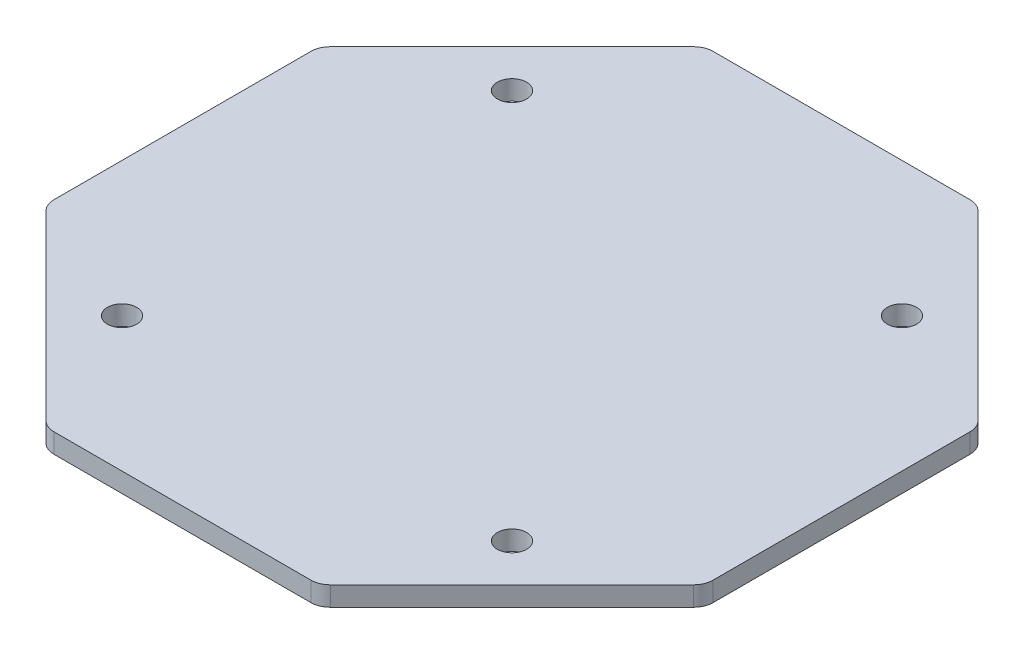
ISO-10303-21;
HEADER;
FILE_DESCRIPTION(('STEP AP214'),'2;1');
FILE_NAME('part.step','',(''),(''),'','','');
FILE_SCHEMA(('AUTOMOTIVE_DESIGN { 1 0 10303 214 1 1 1 1 }'));
ENDSEC;
DATA;
#1=APPLICATION_CONTEXT('core data for automotive mechanical design processes');
#2=APPLICATION_PROTOCOL_DEFINITION('international standard','automotive_design',2000,#1);
#3=PRODUCT_CONTEXT('',#1,'mechanical');
#4=PRODUCT('Part','Part','',(#3));
#5=PRODUCT_RELATED_PRODUCT_CATEGORY('part','',(#4));
#6=PRODUCT_DEFINITION_FORMATION('','',#4);
#7=PRODUCT_DEFINITION_CONTEXT('part definition',#1,'design');
#8=PRODUCT_DEFINITION('design','',#6,#7);
#9=PRODUCT_DEFINITION_SHAPE('','',#8);
#10=(LENGTH_UNIT() NAMED_UNIT(*) SI_UNIT(.MILLI.,.METRE.));
#11=(NAMED_UNIT(*) PLANE_ANGLE_UNIT() SI_UNIT($,.RADIAN.));
#12=(NAMED_UNIT(*) SI_UNIT($,.STERADIAN.) SOLID_ANGLE_UNIT());
#13=UNCERTAINTY_MEASURE_WITH_UNIT(LENGTH_MEASURE(1.E-05),#10,'distance_accuracy_value','');
#14=(GEOMETRIC_REPRESENTATION_CONTEXT(3) GLOBAL_UNCERTAINTY_ASSIGNED_CONTEXT((#13)) GLOBAL_UNIT_ASSIGNED_CONTEXT((#10,
#11,#12)) REPRESENTATION_CONTEXT('',''));
#15=CARTESIAN_POINT('',(0.,0.,0.));
#16=DIRECTION('',(0.,0.,1.));
#17=DIRECTION('',(1.,0.,0.));
#18=AXIS2_PLACEMENT_3D('',#15,#16,#17);
#19=CARTESIAN_POINT('',(-33.7989898732233,2.,-14.));
#20=DIRECTION('',(0.707106781186549,0.,0.707106781186546));
#21=DIRECTION('',(0.707106781186546,0.,-0.707106781186549));
#22=AXIS2_PLACEMENT_3D('',#19,#20,#21);
#23=PLANE('',#22);
#24=DIRECTION('',(-0.707106781186546,0.,0.707106781186549));
#25=VECTOR('',#24,1.);
#26=CARTESIAN_POINT('',(-33.7989898732233,0.,-14.));
#27=LINE('',#26,#25);
#28=CARTESIAN_POINT('',(-14.5857864376269,0.,-33.2132034355965));
#29=VERTEX_POINT('',#28);
#30=CARTESIAN_POINT('',(-33.2132034355964,0.,-14.5857864376269));
#31=VERTEX_POINT('',#30);
#32=EDGE_CURVE('E198',#29,#31,#27,.T.);
#33=ORIENTED_EDGE('',*,*,#32,.T.);
#34=DIRECTION('',(0.,-1.,0.));
#35=VECTOR('',#34,1.);
#36=CARTESIAN_POINT('',(-33.2132034355964,2.,-14.5857864376269));
#37=LINE('',#36,#35);
#38=CARTESIAN_POINT('',(-33.2132034355964,2.,-14.5857864376269));
#39=VERTEX_POINT('',#38);
#40=EDGE_CURVE('E271',#31,#39,#37,.F.);
#41=ORIENTED_EDGE('',*,*,#40,.T.);
#42=DIRECTION('',(-0.707106781186546,0.,0.707106781186549));
#43=VECTOR('',#42,1.);
#44=CARTESIAN_POINT('',(-33.7989898732233,2.,-14.));
#45=LINE('',#44,#43);
#46=CARTESIAN_POINT('',(-14.5857864376269,2.,-33.2132034355965));
#47=VERTEX_POINT('',#46);
#48=EDGE_CURVE('E216',#47,#39,#45,.T.);
#49=ORIENTED_EDGE('',*,*,#48,.F.);
#50=DIRECTION('',(0.,-1.,0.));
#51=VECTOR('',#50,1.);
#52=CARTESIAN_POINT('',(-14.5857864376269,2.,-33.2132034355965));
#53=LINE('',#52,#51);
#54=EDGE_CURVE('E267',#47,#29,#53,.T.);
#55=ORIENTED_EDGE('',*,*,#54,.T.);
#56=EDGE_LOOP('',(#33,#41,#49,#55));
#57=FACE_BOUND('',#56,.T.);
#58=ADVANCED_FACE('F44',(#57),#23,.F.);
#59=CARTESIAN_POINT('',(-33.7989898732233,2.,14.));
#60=DIRECTION('',(1.,0.,0.));
#61=DIRECTION('',(0.,0.,-1.));
#62=AXIS2_PLACEMENT_3D('',#59,#60,#61);
#63=PLANE('',#62);
#64=DIRECTION('',(0.,0.,1.));
#65=VECTOR('',#64,1.);
#66=CARTESIAN_POINT('',(-33.7989898732233,0.,14.));
#67=LINE('',#66,#65);
#68=CARTESIAN_POINT('',(-33.7989898732233,0.,-13.1715728752538));
#69=VERTEX_POINT('',#68);
#70=CARTESIAN_POINT('',(-33.7989898732233,0.,13.1715728752538));
#71=VERTEX_POINT('',#70);
#72=EDGE_CURVE('E191',#69,#71,#67,.T.);
#73=ORIENTED_EDGE('',*,*,#72,.T.);
#74=DIRECTION('',(0.,-1.,0.));
#75=VECTOR('',#74,1.);
#76=CARTESIAN_POINT('',(-33.7989898732233,2.,13.1715728752538));
#77=LINE('',#76,#75);
#78=CARTESIAN_POINT('',(-33.7989898732233,2.,13.1715728752538));
#79=VERTEX_POINT('',#78);
#80=EDGE_CURVE('E166',#71,#79,#77,.F.);
#81=ORIENTED_EDGE('',*,*,#80,.T.);
#82=DIRECTION('',(0.,0.,1.));
#83=VECTOR('',#82,1.);
#84=CARTESIAN_POINT('',(-33.7989898732233,2.,14.));
#85=LINE('',#84,#83);
#86=CARTESIAN_POINT('',(-33.7989898732233,2.,-13.1715728752538));
#87=VERTEX_POINT('',#86);
#88=EDGE_CURVE('E346',#87,#79,#85,.T.);
#89=ORIENTED_EDGE('',*,*,#88,.F.);
#90=DIRECTION('',(0.,-1.,0.));
#91=VECTOR('',#90,1.);
#92=CARTESIAN_POINT('',(-33.7989898732233,2.,-13.1715728752538));
#93=LINE('',#92,#91);
#94=EDGE_CURVE('E172',#87,#69,#93,.T.);
#95=ORIENTED_EDGE('',*,*,#94,.T.);
#96=EDGE_LOOP('',(#73,#81,#89,#95));
#97=FACE_BOUND('',#96,.T.);
#98=ADVANCED_FACE('F382',(#97),#63,.F.);
#99=CARTESIAN_POINT('',(-14.,2.,33.7989898732234));
#100=DIRECTION('',(0.707106781186549,0.,-0.707106781186546));
#101=DIRECTION('',(-0.707106781186546,0.,-0.707106781186549));
#102=AXIS2_PLACEMENT_3D('',#99,#100,#101);
#103=PLANE('',#102);
#104=DIRECTION('',(0.707106781186546,0.,0.707106781186549));
#105=VECTOR('',#104,1.);
#106=CARTESIAN_POINT('',(-14.,2.,33.7989898732234));
#107=LINE('',#106,#105);
#108=CARTESIAN_POINT('',(-33.2132034355964,2.,14.5857864376269));
#109=VERTEX_POINT('',#108);
#110=CARTESIAN_POINT('',(-14.5857864376269,2.,33.2132034355965));
#111=VERTEX_POINT('',#110);
#112=EDGE_CURVE('E182',#109,#111,#107,.T.);
#113=ORIENTED_EDGE('',*,*,#112,.F.);
#114=DIRECTION('',(0.,-1.,0.));
#115=VECTOR('',#114,1.);
#116=CARTESIAN_POINT('',(-33.2132034355964,2.,14.5857864376269));
#117=LINE('',#116,#115);
#118=CARTESIAN_POINT('',(-33.2132034355964,0.,14.5857864376269));
#119=VERTEX_POINT('',#118);
#120=EDGE_CURVE('E165',#109,#119,#117,.T.);
#121=ORIENTED_EDGE('',*,*,#120,.T.);
#122=DIRECTION('',(0.707106781186546,0.,0.707106781186549));
#123=VECTOR('',#122,1.);
#124=CARTESIAN_POINT('',(-14.,0.,33.7989898732234));
#125=LINE('',#124,#123);
#126=CARTESIAN_POINT('',(-14.5857864376269,0.,33.2132034355965));
#127=VERTEX_POINT('',#126);
#128=EDGE_CURVE('E179',#119,#127,#125,.T.);
#129=ORIENTED_EDGE('',*,*,#128,.T.);
#130=DIRECTION('',(0.,-1.,0.));
#131=VECTOR('',#130,1.);
#132=CARTESIAN_POINT('',(-14.5857864376269,2.,33.2132034355965));
#133=LINE('',#132,#131);
#134=EDGE_CURVE('E185',#127,#111,#133,.F.);
#135=ORIENTED_EDGE('',*,*,#134,.T.);
#136=EDGE_LOOP('',(#113,#121,#129,#135));
#137=FACE_BOUND('',#136,.T.);
#138=ADVANCED_FACE('F178',(#137),#103,.F.);
#139=CARTESIAN_POINT('',(14.,2.,33.7989898732234));
#140=DIRECTION('',(0.,0.,-1.));
#141=DIRECTION('',(-1.,0.,0.));
#142=AXIS2_PLACEMENT_3D('',#139,#140,#141);
#143=PLANE('',#142);
#144=DIRECTION('',(1.,0.,0.));
#145=VECTOR('',#144,1.);
#146=CARTESIAN_POINT('',(14.,0.,33.7989898732234));
#147=LINE('',#146,#145);
#148=CARTESIAN_POINT('',(-13.1715728752538,0.,33.7989898732234));
#149=VERTEX_POINT('',#148);
#150=CARTESIAN_POINT('',(13.1715728752538,0.,33.7989898732234));
#151=VERTEX_POINT('',#150);
#152=EDGE_CURVE('E190',#149,#151,#147,.T.);
#153=ORIENTED_EDGE('',*,*,#152,.T.);
#154=DIRECTION('',(0.,-1.,0.));
#155=VECTOR('',#154,1.);
#156=CARTESIAN_POINT('',(13.1715728752538,2.,33.7989898732234));
#157=LINE('',#156,#155);
#158=CARTESIAN_POINT('',(13.1715728752538,2.,33.7989898732234));
#159=VERTEX_POINT('',#158);
#160=EDGE_CURVE('E11',#151,#159,#157,.F.);
#161=ORIENTED_EDGE('',*,*,#160,.T.);
#162=DIRECTION('',(1.,0.,0.));
#163=VECTOR('',#162,1.);
#164=CARTESIAN_POINT('',(14.,2.,33.7989898732234));
#165=LINE('',#164,#163);
#166=CARTESIAN_POINT('',(-13.1715728752538,2.,33.7989898732234));
#167=VERTEX_POINT('',#166);
#168=EDGE_CURVE('E340',#167,#159,#165,.T.);
#169=ORIENTED_EDGE('',*,*,#168,.F.);
#170=DIRECTION('',(0.,-1.,0.));
#171=VECTOR('',#170,1.);
#172=CARTESIAN_POINT('',(-13.1715728752538,2.,33.7989898732234));
#173=LINE('',#172,#171);
#174=EDGE_CURVE('E54',#167,#149,#173,.T.);
#175=ORIENTED_EDGE('',*,*,#174,.T.);
#176=EDGE_LOOP('',(#153,#161,#169,#175));
#177=FACE_BOUND('',#176,.T.);
#178=ADVANCED_FACE('F449',(#177),#143,.F.);
#179=CARTESIAN_POINT('',(33.7989898732233,2.,14.));
#180=DIRECTION('',(-0.707106781186549,0.,-0.707106781186546));
#181=DIRECTION('',(-0.707106781186546,0.,0.707106781186549));
#182=AXIS2_PLACEMENT_3D('',#179,#180,#181);
#183=PLANE('',#182);
#184=DIRECTION('',(0.707106781186546,0.,-0.707106781186549));
#185=VECTOR('',#184,1.);
#186=CARTESIAN_POINT('',(33.7989898732233,0.,14.));
#187=LINE('',#186,#185);
#188=CARTESIAN_POINT('',(14.5857864376269,0.,33.2132034355965));
#189=VERTEX_POINT('',#188);
#190=CARTESIAN_POINT('',(33.2132034355964,0.,14.5857864376269));
#191=VERTEX_POINT('',#190);
#192=EDGE_CURVE('E196',#189,#191,#187,.T.);
#193=ORIENTED_EDGE('',*,*,#192,.T.);
#194=DIRECTION('',(0.,-1.,0.));
#195=VECTOR('',#194,1.);
#196=CARTESIAN_POINT('',(33.2132034355964,2.,14.5857864376269));
#197=LINE('',#196,#195);
#198=CARTESIAN_POINT('',(33.2132034355964,2.,14.5857864376269));
#199=VERTEX_POINT('',#198);
#200=EDGE_CURVE('E298',#191,#199,#197,.F.);
#201=ORIENTED_EDGE('',*,*,#200,.T.);
#202=DIRECTION('',(0.707106781186546,0.,-0.707106781186549));
#203=VECTOR('',#202,1.);
#204=CARTESIAN_POINT('',(33.7989898732233,2.,14.));
#205=LINE('',#204,#203);
#206=CARTESIAN_POINT('',(14.5857864376269,2.,33.2132034355965));
#207=VERTEX_POINT('',#206);
#208=EDGE_CURVE('E336',#207,#199,#205,.T.);
#209=ORIENTED_EDGE('',*,*,#208,.F.);
#210=DIRECTION('',(0.,-1.,0.));
#211=VECTOR('',#210,1.);
#212=CARTESIAN_POINT('',(14.5857864376269,2.,33.2132034355965));
#213=LINE('',#212,#211);
#214=EDGE_CURVE('E294',#207,#189,#213,.T.);
#215=ORIENTED_EDGE('',*,*,#214,.T.);
#216=EDGE_LOOP('',(#193,#201,#209,#215));
#217=FACE_BOUND('',#216,.T.);
#218=ADVANCED_FACE('F432',(#217),#183,.F.);
#219=CARTESIAN_POINT('',(33.7989898732233,2.,-14.));
#220=DIRECTION('',(-1.,0.,0.));
#221=DIRECTION('',(0.,0.,1.));
#222=AXIS2_PLACEMENT_3D('',#219,#220,#221);
#223=PLANE('',#222);
#224=DIRECTION('',(0.,0.,-1.));
#225=VECTOR('',#224,1.);
#226=CARTESIAN_POINT('',(33.7989898732233,0.,-14.));
#227=LINE('',#226,#225);
#228=CARTESIAN_POINT('',(33.7989898732233,0.,13.1715728752538));
#229=VERTEX_POINT('',#228);
#230=CARTESIAN_POINT('',(33.7989898732233,0.,-13.1715728752538));
#231=VERTEX_POINT('',#230);
#232=EDGE_CURVE('E205',#229,#231,#227,.T.);
#233=ORIENTED_EDGE('',*,*,#232,.T.);
#234=DIRECTION('',(0.,-1.,0.));
#235=VECTOR('',#234,1.);
#236=CARTESIAN_POINT('',(33.7989898732233,2.,-13.1715728752538));
#237=LINE('',#236,#235);
#238=CARTESIAN_POINT('',(33.7989898732233,2.,-13.1715728752538));
#239=VERTEX_POINT('',#238);
#240=EDGE_CURVE('E291',#231,#239,#237,.F.);
#241=ORIENTED_EDGE('',*,*,#240,.T.);
#242=DIRECTION('',(0.,0.,-1.));
#243=VECTOR('',#242,1.);
#244=CARTESIAN_POINT('',(33.7989898732233,2.,-14.));
#245=LINE('',#244,#243);
#246=CARTESIAN_POINT('',(33.7989898732233,2.,13.1715728752538));
#247=VERTEX_POINT('',#246);
#248=EDGE_CURVE('E332',#247,#239,#245,.T.);
#249=ORIENTED_EDGE('',*,*,#248,.F.);
#250=DIRECTION('',(0.,-1.,0.));
#251=VECTOR('',#250,1.);
#252=CARTESIAN_POINT('',(33.7989898732233,2.,13.1715728752538));
#253=LINE('',#252,#251);
#254=EDGE_CURVE('E287',#247,#229,#253,.T.);
#255=ORIENTED_EDGE('',*,*,#254,.T.);
#256=EDGE_LOOP('',(#233,#241,#249,#255));
#257=FACE_BOUND('',#256,.T.);
#258=ADVANCED_FACE('F439',(#257),#223,.F.);
#259=CARTESIAN_POINT('',(14.,2.,-33.7989898732234));
#260=DIRECTION('',(-0.707106781186549,0.,0.707106781186546));
#261=DIRECTION('',(0.707106781186546,0.,0.707106781186549));
#262=AXIS2_PLACEMENT_3D('',#259,#260,#261);
#263=PLANE('',#262);
#264=DIRECTION('',(-0.707106781186546,0.,-0.707106781186549));
#265=VECTOR('',#264,1.);
#266=CARTESIAN_POINT('',(14.,0.,-33.7989898732234));
#267=LINE('',#266,#265);
#268=CARTESIAN_POINT('',(33.2132034355964,0.,-14.5857864376269));
#269=VERTEX_POINT('',#268);
#270=CARTESIAN_POINT('',(14.5857864376269,0.,-33.2132034355965));
#271=VERTEX_POINT('',#270);
#272=EDGE_CURVE('E209',#269,#271,#267,.T.);
#273=ORIENTED_EDGE('',*,*,#272,.T.);
#274=DIRECTION('',(0.,-1.,0.));
#275=VECTOR('',#274,1.);
#276=CARTESIAN_POINT('',(14.5857864376269,2.,-33.2132034355965));
#277=LINE('',#276,#275);
#278=CARTESIAN_POINT('',(14.5857864376269,2.,-33.2132034355965));
#279=VERTEX_POINT('',#278);
#280=EDGE_CURVE('E284',#271,#279,#277,.F.);
#281=ORIENTED_EDGE('',*,*,#280,.T.);
#282=DIRECTION('',(-0.707106781186546,0.,-0.707106781186549));
#283=VECTOR('',#282,1.);
#284=CARTESIAN_POINT('',(14.,2.,-33.7989898732234));
#285=LINE('',#284,#283);
#286=CARTESIAN_POINT('',(33.2132034355964,2.,-14.5857864376269));
#287=VERTEX_POINT('',#286);
#288=EDGE_CURVE('E329',#287,#279,#285,.T.);
#289=ORIENTED_EDGE('',*,*,#288,.F.);
#290=DIRECTION('',(0.,-1.,0.));
#291=VECTOR('',#290,1.);
#292=CARTESIAN_POINT('',(33.2132034355964,2.,-14.5857864376269));
#293=LINE('',#292,#291);
#294=EDGE_CURVE('E280',#287,#269,#293,.T.);
#295=ORIENTED_EDGE('',*,*,#294,.T.);
#296=EDGE_LOOP('',(#273,#281,#289,#295));
#297=FACE_BOUND('',#296,.T.);
#298=ADVANCED_FACE('F445',(#297),#263,.F.);
#299=CARTESIAN_POINT('',(-14.,2.,-33.7989898732234));
#300=DIRECTION('',(0.,0.,1.));
#301=DIRECTION('',(1.,0.,0.));
#302=AXIS2_PLACEMENT_3D('',#299,#300,#301);
#303=PLANE('',#302);
#304=DIRECTION('',(-1.,0.,0.));
#305=VECTOR('',#304,1.);
#306=CARTESIAN_POINT('',(-14.,0.,-33.7989898732234));
#307=LINE('',#306,#305);
#308=CARTESIAN_POINT('',(13.1715728752538,0.,-33.7989898732234));
#309=VERTEX_POINT('',#308);
#310=CARTESIAN_POINT('',(-13.1715728752538,0.,-33.7989898732234));
#311=VERTEX_POINT('',#310);
#312=EDGE_CURVE('E213',#309,#311,#307,.T.);
#313=ORIENTED_EDGE('',*,*,#312,.T.);
#314=DIRECTION('',(0.,-1.,0.));
#315=VECTOR('',#314,1.);
#316=CARTESIAN_POINT('',(-13.1715728752538,2.,-33.7989898732234));
#317=LINE('',#316,#315);
#318=CARTESIAN_POINT('',(-13.1715728752538,2.,-33.7989898732234));
#319=VERTEX_POINT('',#318);
#320=EDGE_CURVE('E62',#311,#319,#317,.F.);
#321=ORIENTED_EDGE('',*,*,#320,.T.);
#322=DIRECTION('',(-1.,0.,0.));
#323=VECTOR('',#322,1.);
#324=CARTESIAN_POINT('',(-14.,2.,-33.7989898732234));
#325=LINE('',#324,#323);
#326=CARTESIAN_POINT('',(13.1715728752538,2.,-33.7989898732234));
#327=VERTEX_POINT('',#326);
#328=EDGE_CURVE('E218',#327,#319,#325,.T.);
#329=ORIENTED_EDGE('',*,*,#328,.F.);
#330=DIRECTION('',(0.,-1.,0.));
#331=VECTOR('',#330,1.);
#332=CARTESIAN_POINT('',(13.1715728752538,2.,-33.7989898732234));
#333=LINE('',#332,#331);
#334=EDGE_CURVE('E274',#327,#309,#333,.T.);
#335=ORIENTED_EDGE('',*,*,#334,.T.);
#336=EDGE_LOOP('',(#313,#321,#329,#335));
#337=FACE_BOUND('',#336,.T.);
#338=ADVANCED_FACE('F374',(#337),#303,.F.);
#339=CARTESIAN_POINT('',(0.,2.,0.));
#340=DIRECTION('',(0.,-1.,0.));
#341=DIRECTION('',(0.,0.,-1.));
#342=AXIS2_PLACEMENT_3D('',#339,#340,#341);
#343=PLANE('',#342);
#344=CARTESIAN_POINT('',(-20.,2.,20.));
#345=DIRECTION('',(0.,1.,0.));
#346=DIRECTION('',(0.,0.,1.));
#347=AXIS2_PLACEMENT_3D('',#344,#345,#346);
#348=CIRCLE('',#347,1.5);
#349=CARTESIAN_POINT('',(-20.,2.,21.5));
#350=VERTEX_POINT('',#349);
#351=EDGE_CURVE('E357',#350,#350,#348,.T.);
#352=ORIENTED_EDGE('',*,*,#351,.F.);
#353=EDGE_LOOP('',(#352));
#354=FACE_BOUND('',#353,.T.);
#355=CARTESIAN_POINT('',(20.,2.,20.));
#356=DIRECTION('',(0.,1.,0.));
#357=DIRECTION('',(0.,0.,1.));
#358=AXIS2_PLACEMENT_3D('',#355,#356,#357);
#359=CIRCLE('',#358,1.5);
#360=CARTESIAN_POINT('',(20.,2.,21.5));
#361=VERTEX_POINT('',#360);
#362=EDGE_CURVE('E361',#361,#361,#359,.T.);
#363=ORIENTED_EDGE('',*,*,#362,.F.);
#364=EDGE_LOOP('',(#363));
#365=FACE_BOUND('',#364,.T.);
#366=CARTESIAN_POINT('',(20.,2.,-20.));
#367=DIRECTION('',(0.,1.,0.));
#368=DIRECTION('',(0.,0.,1.));
#369=AXIS2_PLACEMENT_3D('',#366,#367,#368);
#370=CIRCLE('',#369,1.5);
#371=CARTESIAN_POINT('',(20.,2.,-18.5));
#372=VERTEX_POINT('',#371);
#373=EDGE_CURVE('E356',#372,#372,#370,.T.);
#374=ORIENTED_EDGE('',*,*,#373,.F.);
#375=EDGE_LOOP('',(#374));
#376=FACE_BOUND('',#375,.T.);
#377=CARTESIAN_POINT('',(-20.,2.,-20.));
#378=DIRECTION('',(0.,1.,0.));
#379=DIRECTION('',(0.,0.,1.));
#380=AXIS2_PLACEMENT_3D('',#377,#378,#379);
#381=CIRCLE('',#380,1.5);
#382=CARTESIAN_POINT('',(-20.,2.,-18.5));
#383=VERTEX_POINT('',#382);
#384=EDGE_CURVE('E309',#383,#383,#381,.T.);
#385=ORIENTED_EDGE('',*,*,#384,.F.);
#386=EDGE_LOOP('',(#385));
#387=FACE_BOUND('',#386,.T.);
#388=ORIENTED_EDGE('',*,*,#88,.T.);
#389=CARTESIAN_POINT('',(-31.7989898732233,2.,13.1715728752538));
#390=DIRECTION('',(0.,-1.,0.));
#391=DIRECTION('',(0.,0.,-1.));
#392=AXIS2_PLACEMENT_3D('',#389,#390,#391);
#393=CIRCLE('',#392,2.);
#394=EDGE_CURVE('E264',#79,#109,#393,.F.);
#395=ORIENTED_EDGE('',*,*,#394,.T.);
#396=ORIENTED_EDGE('',*,*,#112,.T.);
#397=CARTESIAN_POINT('',(-13.1715728752538,2.,31.7989898732234));
#398=DIRECTION('',(0.,-1.,0.));
#399=DIRECTION('',(0.,0.,-1.));
#400=AXIS2_PLACEMENT_3D('',#397,#398,#399);
#401=CIRCLE('',#400,2.);
#402=EDGE_CURVE('E244',#111,#167,#401,.F.);
#403=ORIENTED_EDGE('',*,*,#402,.T.);
#404=ORIENTED_EDGE('',*,*,#168,.T.);
#405=CARTESIAN_POINT('',(13.1715728752538,2.,31.7989898732234));
#406=DIRECTION('',(0.,-1.,0.));
#407=DIRECTION('',(0.,0.,-1.));
#408=AXIS2_PLACEMENT_3D('',#405,#406,#407);
#409=CIRCLE('',#408,2.);
#410=EDGE_CURVE('E247',#159,#207,#409,.F.);
#411=ORIENTED_EDGE('',*,*,#410,.T.);
#412=ORIENTED_EDGE('',*,*,#208,.T.);
#413=CARTESIAN_POINT('',(31.7989898732233,2.,13.1715728752538));
#414=DIRECTION('',(0.,-1.,0.));
#415=DIRECTION('',(0.,0.,-1.));
#416=AXIS2_PLACEMENT_3D('',#413,#414,#415);
#417=CIRCLE('',#416,2.);
#418=EDGE_CURVE('E250',#199,#247,#417,.F.);
#419=ORIENTED_EDGE('',*,*,#418,.T.);
#420=ORIENTED_EDGE('',*,*,#248,.T.);
#421=CARTESIAN_POINT('',(31.7989898732233,2.,-13.1715728752538));
#422=DIRECTION('',(0.,-1.,0.));
#423=DIRECTION('',(0.,0.,-1.));
#424=AXIS2_PLACEMENT_3D('',#421,#422,#423);
#425=CIRCLE('',#424,2.);
#426=EDGE_CURVE('E253',#239,#287,#425,.F.);
#427=ORIENTED_EDGE('',*,*,#426,.T.);
#428=ORIENTED_EDGE('',*,*,#288,.T.);
#429=CARTESIAN_POINT('',(13.1715728752538,2.,-31.7989898732234));
#430=DIRECTION('',(0.,-1.,0.));
#431=DIRECTION('',(0.,0.,-1.));
#432=AXIS2_PLACEMENT_3D('',#429,#430,#431);
#433=CIRCLE('',#432,2.);
#434=EDGE_CURVE('E69',#279,#327,#433,.F.);
#435=ORIENTED_EDGE('',*,*,#434,.T.);
#436=ORIENTED_EDGE('',*,*,#328,.T.);
#437=CARTESIAN_POINT('',(-13.1715728752538,2.,-31.7989898732234));
#438=DIRECTION('',(0.,-1.,0.));
#439=DIRECTION('',(0.,0.,-1.));
#440=AXIS2_PLACEMENT_3D('',#437,#438,#439);
#441=CIRCLE('',#440,2.);
#442=EDGE_CURVE('E258',#319,#47,#441,.F.);
#443=ORIENTED_EDGE('',*,*,#442,.T.);
#444=ORIENTED_EDGE('',*,*,#48,.T.);
#445=CARTESIAN_POINT('',(-31.7989898732233,2.,-13.1715728752538));
#446=DIRECTION('',(0.,-1.,0.));
#447=DIRECTION('',(0.,0.,-1.));
#448=AXIS2_PLACEMENT_3D('',#445,#446,#447);
#449=CIRCLE('',#448,2.);
#450=EDGE_CURVE('E261',#39,#87,#449,.F.);
#451=ORIENTED_EDGE('',*,*,#450,.T.);
#452=EDGE_LOOP('',(#388,#395,#396,#403,#404,#411,#412,#419,#420,#427,#428,#435,#436,#443,#444,#451));
#453=FACE_BOUND('',#452,.T.);
#454=ADVANCED_FACE('F371',(#354,#365,#376,#387,#453),#343,.F.);
#455=CARTESIAN_POINT('',(0.,0.,0.));
#456=DIRECTION('',(0.,-1.,0.));
#457=DIRECTION('',(0.,0.,-1.));
#458=AXIS2_PLACEMENT_3D('',#455,#456,#457);
#459=PLANE('',#458);
#460=CARTESIAN_POINT('',(-20.,0.,20.));
#461=DIRECTION('',(0.,-1.,0.));
#462=DIRECTION('',(0.,0.,-1.));
#463=AXIS2_PLACEMENT_3D('',#460,#461,#462);
#464=CIRCLE('',#463,1.5);
#465=CARTESIAN_POINT('',(-20.,0.,18.5));
#466=VERTEX_POINT('',#465);
#467=EDGE_CURVE('E48',#466,#466,#464,.T.);
#468=ORIENTED_EDGE('',*,*,#467,.F.);
#469=EDGE_LOOP('',(#468));
#470=FACE_BOUND('',#469,.T.);
#471=CARTESIAN_POINT('',(20.,0.,20.));
#472=DIRECTION('',(0.,-1.,0.));
#473=DIRECTION('',(0.,0.,-1.));
#474=AXIS2_PLACEMENT_3D('',#471,#472,#473);
#475=CIRCLE('',#474,1.5);
#476=CARTESIAN_POINT('',(20.,0.,18.5));
#477=VERTEX_POINT('',#476);
#478=EDGE_CURVE('E312',#477,#477,#475,.T.);
#479=ORIENTED_EDGE('',*,*,#478,.F.);
#480=EDGE_LOOP('',(#479));
#481=FACE_BOUND('',#480,.T.);
#482=CARTESIAN_POINT('',(20.,0.,-20.));
#483=DIRECTION('',(0.,-1.,0.));
#484=DIRECTION('',(0.,0.,-1.));
#485=AXIS2_PLACEMENT_3D('',#482,#483,#484);
#486=CIRCLE('',#485,1.5);
#487=CARTESIAN_POINT('',(20.,0.,-21.5));
#488=VERTEX_POINT('',#487);
#489=EDGE_CURVE('E308',#488,#488,#486,.T.);
#490=ORIENTED_EDGE('',*,*,#489,.F.);
#491=EDGE_LOOP('',(#490));
#492=FACE_BOUND('',#491,.T.);
#493=CARTESIAN_POINT('',(-20.,0.,-20.));
#494=DIRECTION('',(0.,-1.,0.));
#495=DIRECTION('',(0.,0.,-1.));
#496=AXIS2_PLACEMENT_3D('',#493,#494,#495);
#497=CIRCLE('',#496,1.5);
#498=CARTESIAN_POINT('',(-20.,0.,-21.5));
#499=VERTEX_POINT('',#498);
#500=EDGE_CURVE('E304',#499,#499,#497,.T.);
#501=ORIENTED_EDGE('',*,*,#500,.F.);
#502=EDGE_LOOP('',(#501));
#503=FACE_BOUND('',#502,.T.);
#504=ORIENTED_EDGE('',*,*,#128,.F.);
#505=CARTESIAN_POINT('',(-31.7989898732233,0.,13.1715728752538));
#506=DIRECTION('',(0.,-1.,0.));
#507=DIRECTION('',(0.,0.,-1.));
#508=AXIS2_PLACEMENT_3D('',#505,#506,#507);
#509=CIRCLE('',#508,2.);
#510=EDGE_CURVE('E161',#119,#71,#509,.T.);
#511=ORIENTED_EDGE('',*,*,#510,.T.);
#512=ORIENTED_EDGE('',*,*,#72,.F.);
#513=CARTESIAN_POINT('',(-31.7989898732233,0.,-13.1715728752538));
#514=DIRECTION('',(0.,-1.,0.));
#515=DIRECTION('',(0.,0.,-1.));
#516=AXIS2_PLACEMENT_3D('',#513,#514,#515);
#517=CIRCLE('',#516,2.);
#518=EDGE_CURVE('E173',#69,#31,#517,.T.);
#519=ORIENTED_EDGE('',*,*,#518,.T.);
#520=ORIENTED_EDGE('',*,*,#32,.F.);
#521=CARTESIAN_POINT('',(-13.1715728752538,0.,-31.7989898732234));
#522=DIRECTION('',(0.,-1.,0.));
#523=DIRECTION('',(0.,0.,-1.));
#524=AXIS2_PLACEMENT_3D('',#521,#522,#523);
#525=CIRCLE('',#524,2.);
#526=EDGE_CURVE('E234',#29,#311,#525,.T.);
#527=ORIENTED_EDGE('',*,*,#526,.T.);
#528=ORIENTED_EDGE('',*,*,#312,.F.);
#529=CARTESIAN_POINT('',(13.1715728752538,0.,-31.7989898732234));
#530=DIRECTION('',(0.,-1.,0.));
#531=DIRECTION('',(0.,0.,-1.));
#532=AXIS2_PLACEMENT_3D('',#529,#530,#531);
#533=CIRCLE('',#532,2.);
#534=EDGE_CURVE('E231',#309,#271,#533,.T.);
#535=ORIENTED_EDGE('',*,*,#534,.T.);
#536=ORIENTED_EDGE('',*,*,#272,.F.);
#537=CARTESIAN_POINT('',(31.7989898732233,0.,-13.1715728752538));
#538=DIRECTION('',(0.,-1.,0.));
#539=DIRECTION('',(0.,0.,-1.));
#540=AXIS2_PLACEMENT_3D('',#537,#538,#539);
#541=CIRCLE('',#540,2.);
#542=EDGE_CURVE('E228',#269,#231,#541,.T.);
#543=ORIENTED_EDGE('',*,*,#542,.T.);
#544=ORIENTED_EDGE('',*,*,#232,.F.);
#545=CARTESIAN_POINT('',(31.7989898732233,0.,13.1715728752538));
#546=DIRECTION('',(0.,-1.,0.));
#547=DIRECTION('',(0.,0.,-1.));
#548=AXIS2_PLACEMENT_3D('',#545,#546,#547);
#549=CIRCLE('',#548,2.);
#550=EDGE_CURVE('E225',#229,#191,#549,.T.);
#551=ORIENTED_EDGE('',*,*,#550,.T.);
#552=ORIENTED_EDGE('',*,*,#192,.F.);
#553=CARTESIAN_POINT('',(13.1715728752538,0.,31.7989898732234));
#554=DIRECTION('',(0.,-1.,0.));
#555=DIRECTION('',(0.,0.,-1.));
#556=AXIS2_PLACEMENT_3D('',#553,#554,#555);
#557=CIRCLE('',#556,2.);
#558=EDGE_CURVE('E222',#189,#151,#557,.T.);
#559=ORIENTED_EDGE('',*,*,#558,.T.);
#560=ORIENTED_EDGE('',*,*,#152,.F.);
#561=CARTESIAN_POINT('',(-13.1715728752538,0.,31.7989898732234));
#562=DIRECTION('',(0.,-1.,0.));
#563=DIRECTION('',(0.,0.,-1.));
#564=AXIS2_PLACEMENT_3D('',#561,#562,#563);
#565=CIRCLE('',#564,2.);
#566=EDGE_CURVE('E184',#149,#127,#565,.T.);
#567=ORIENTED_EDGE('',*,*,#566,.T.);
#568=EDGE_LOOP('',(#504,#511,#512,#519,#520,#527,#528,#535,#536,#543,#544,#551,#552,#559,#560,#567));
#569=FACE_BOUND('',#568,.T.);
#570=ADVANCED_FACE('F187',(#470,#481,#492,#503,#569),#459,.T.);
#571=CARTESIAN_POINT('',(-31.7989898732233,2.,13.1715728752538));
#572=DIRECTION('',(0.,-1.,0.));
#573=DIRECTION('',(0.,0.,-1.));
#574=AXIS2_PLACEMENT_3D('',#571,#572,#573);
#575=CYLINDRICAL_SURFACE('',#574,2.);
#576=ORIENTED_EDGE('',*,*,#394,.F.);
#577=ORIENTED_EDGE('',*,*,#80,.F.);
#578=ORIENTED_EDGE('',*,*,#510,.F.);
#579=ORIENTED_EDGE('',*,*,#120,.F.);
#580=EDGE_LOOP('',(#576,#577,#578,#579));
#581=FACE_BOUND('',#580,.T.);
#582=ADVANCED_FACE('F164',(#581),#575,.T.);
#583=CARTESIAN_POINT('',(-31.7989898732233,2.,-13.1715728752538));
#584=DIRECTION('',(0.,-1.,0.));
#585=DIRECTION('',(0.,0.,-1.));
#586=AXIS2_PLACEMENT_3D('',#583,#584,#585);
#587=CYLINDRICAL_SURFACE('',#586,2.);
#588=ORIENTED_EDGE('',*,*,#450,.F.);
#589=ORIENTED_EDGE('',*,*,#40,.F.);
#590=ORIENTED_EDGE('',*,*,#518,.F.);
#591=ORIENTED_EDGE('',*,*,#94,.F.);
#592=EDGE_LOOP('',(#588,#589,#590,#591));
#593=FACE_BOUND('',#592,.T.);
#594=ADVANCED_FACE('F384',(#593),#587,.T.);
#595=CARTESIAN_POINT('',(-13.1715728752538,2.,-31.7989898732234));
#596=DIRECTION('',(0.,-1.,0.));
#597=DIRECTION('',(0.,0.,-1.));
#598=AXIS2_PLACEMENT_3D('',#595,#596,#597);
#599=CYLINDRICAL_SURFACE('',#598,2.);
#600=ORIENTED_EDGE('',*,*,#442,.F.);
#601=ORIENTED_EDGE('',*,*,#320,.F.);
#602=ORIENTED_EDGE('',*,*,#526,.F.);
#603=ORIENTED_EDGE('',*,*,#54,.F.);
#604=EDGE_LOOP('',(#600,#601,#602,#603));
#605=FACE_BOUND('',#604,.T.);
#606=ADVANCED_FACE('F390',(#605),#599,.T.);
#607=CARTESIAN_POINT('',(13.1715728752538,2.,-31.7989898732234));
#608=DIRECTION('',(0.,-1.,0.));
#609=DIRECTION('',(0.,0.,-1.));
#610=AXIS2_PLACEMENT_3D('',#607,#608,#609);
#611=CYLINDRICAL_SURFACE('',#610,2.);
#612=ORIENTED_EDGE('',*,*,#434,.F.);
#613=ORIENTED_EDGE('',*,*,#280,.F.);
#614=ORIENTED_EDGE('',*,*,#534,.F.);
#615=ORIENTED_EDGE('',*,*,#334,.F.);
#616=EDGE_LOOP('',(#612,#613,#614,#615));
#617=FACE_BOUND('',#616,.T.);
#618=ADVANCED_FACE('F406',(#617),#611,.T.);
#619=CARTESIAN_POINT('',(31.7989898732233,2.,-13.1715728752538));
#620=DIRECTION('',(0.,-1.,0.));
#621=DIRECTION('',(0.,0.,-1.));
#622=AXIS2_PLACEMENT_3D('',#619,#620,#621);
#623=CYLINDRICAL_SURFACE('',#622,2.);
#624=ORIENTED_EDGE('',*,*,#426,.F.);
#625=ORIENTED_EDGE('',*,*,#240,.F.);
#626=ORIENTED_EDGE('',*,*,#542,.F.);
#627=ORIENTED_EDGE('',*,*,#294,.F.);
#628=EDGE_LOOP('',(#624,#625,#626,#627));
#629=FACE_BOUND('',#628,.T.);
#630=ADVANCED_FACE('F409',(#629),#623,.T.);
#631=CARTESIAN_POINT('',(31.7989898732233,2.,13.1715728752538));
#632=DIRECTION('',(0.,-1.,0.));
#633=DIRECTION('',(0.,0.,-1.));
#634=AXIS2_PLACEMENT_3D('',#631,#632,#633);
#635=CYLINDRICAL_SURFACE('',#634,2.);
#636=ORIENTED_EDGE('',*,*,#418,.F.);
#637=ORIENTED_EDGE('',*,*,#200,.F.);
#638=ORIENTED_EDGE('',*,*,#550,.F.);
#639=ORIENTED_EDGE('',*,*,#254,.F.);
#640=EDGE_LOOP('',(#636,#637,#638,#639));
#641=FACE_BOUND('',#640,.T.);
#642=ADVANCED_FACE('F413',(#641),#635,.T.);
#643=CARTESIAN_POINT('',(13.1715728752538,2.,31.7989898732234));
#644=DIRECTION('',(0.,-1.,0.));
#645=DIRECTION('',(0.,0.,-1.));
#646=AXIS2_PLACEMENT_3D('',#643,#644,#645);
#647=CYLINDRICAL_SURFACE('',#646,2.);
#648=ORIENTED_EDGE('',*,*,#410,.F.);
#649=ORIENTED_EDGE('',*,*,#160,.F.);
#650=ORIENTED_EDGE('',*,*,#558,.F.);
#651=ORIENTED_EDGE('',*,*,#214,.F.);
#652=EDGE_LOOP('',(#648,#649,#650,#651));
#653=FACE_BOUND('',#652,.T.);
#654=ADVANCED_FACE('F416',(#653),#647,.T.);
#655=CARTESIAN_POINT('',(-13.1715728752538,2.,31.7989898732234));
#656=DIRECTION('',(0.,-1.,0.));
#657=DIRECTION('',(0.,0.,-1.));
#658=AXIS2_PLACEMENT_3D('',#655,#656,#657);
#659=CYLINDRICAL_SURFACE('',#658,2.);
#660=ORIENTED_EDGE('',*,*,#402,.F.);
#661=ORIENTED_EDGE('',*,*,#134,.F.);
#662=ORIENTED_EDGE('',*,*,#566,.F.);
#663=ORIENTED_EDGE('',*,*,#174,.F.);
#664=EDGE_LOOP('',(#660,#661,#662,#663));
#665=FACE_BOUND('',#664,.T.);
#666=ADVANCED_FACE('F46',(#665),#659,.T.);
#667=CARTESIAN_POINT('',(-20.,-8.,-20.));
#668=DIRECTION('',(0.,1.,0.));
#669=DIRECTION('',(0.,0.,1.));
#670=AXIS2_PLACEMENT_3D('',#667,#668,#669);
#671=CYLINDRICAL_SURFACE('',#670,1.5);
#672=ORIENTED_EDGE('',*,*,#500,.T.);
#673=EDGE_LOOP('',(#672));
#674=FACE_BOUND('',#673,.T.);
#675=ORIENTED_EDGE('',*,*,#384,.T.);
#676=EDGE_LOOP('',(#675));
#677=FACE_BOUND('',#676,.T.);
#678=ADVANCED_FACE('F423',(#674,#677),#671,.F.);
#679=CARTESIAN_POINT('',(20.,-8.,-20.));
#680=DIRECTION('',(0.,1.,0.));
#681=DIRECTION('',(0.,0.,1.));
#682=AXIS2_PLACEMENT_3D('',#679,#680,#681);
#683=CYLINDRICAL_SURFACE('',#682,1.5);
#684=ORIENTED_EDGE('',*,*,#489,.T.);
#685=EDGE_LOOP('',(#684));
#686=FACE_BOUND('',#685,.T.);
#687=ORIENTED_EDGE('',*,*,#373,.T.);
#688=EDGE_LOOP('',(#687));
#689=FACE_BOUND('',#688,.T.);
#690=ADVANCED_FACE('F369',(#686,#689),#683,.F.);
#691=CARTESIAN_POINT('',(20.,-8.,20.));
#692=DIRECTION('',(0.,1.,0.));
#693=DIRECTION('',(0.,0.,1.));
#694=AXIS2_PLACEMENT_3D('',#691,#692,#693);
#695=CYLINDRICAL_SURFACE('',#694,1.5);
#696=ORIENTED_EDGE('',*,*,#478,.T.);
#697=EDGE_LOOP('',(#696));
#698=FACE_BOUND('',#697,.T.);
#699=ORIENTED_EDGE('',*,*,#362,.T.);
#700=EDGE_LOOP('',(#699));
#701=FACE_BOUND('',#700,.T.);
#702=ADVANCED_FACE('F475',(#698,#701),#695,.F.);
#703=CARTESIAN_POINT('',(-20.,-8.,20.));
#704=DIRECTION('',(0.,1.,0.));
#705=DIRECTION('',(0.,0.,1.));
#706=AXIS2_PLACEMENT_3D('',#703,#704,#705);
#707=CYLINDRICAL_SURFACE('',#706,1.5);
#708=ORIENTED_EDGE('',*,*,#467,.T.);
#709=EDGE_LOOP('',(#708));
#710=FACE_BOUND('',#709,.T.);
#711=ORIENTED_EDGE('',*,*,#351,.T.);
#712=EDGE_LOOP('',(#711));
#713=FACE_BOUND('',#712,.T.);
#714=ADVANCED_FACE('F472',(#710,#713),#707,.F.);
#715=CLOSED_SHELL('',(#58,#98,#138,#178,#218,#258,#298,#338,#454,#570,#582,#594,#606,#618,#630,
#642,#654,#666,#678,#690,#702,#714));
#716=MANIFOLD_SOLID_BREP('B2',#715);
#717=ADVANCED_BREP_SHAPE_REPRESENTATION('',(#18,#716),#14);
#718=SHAPE_DEFINITION_REPRESENTATION(#9,#717);
ENDSEC;
END-ISO-10303-21;
